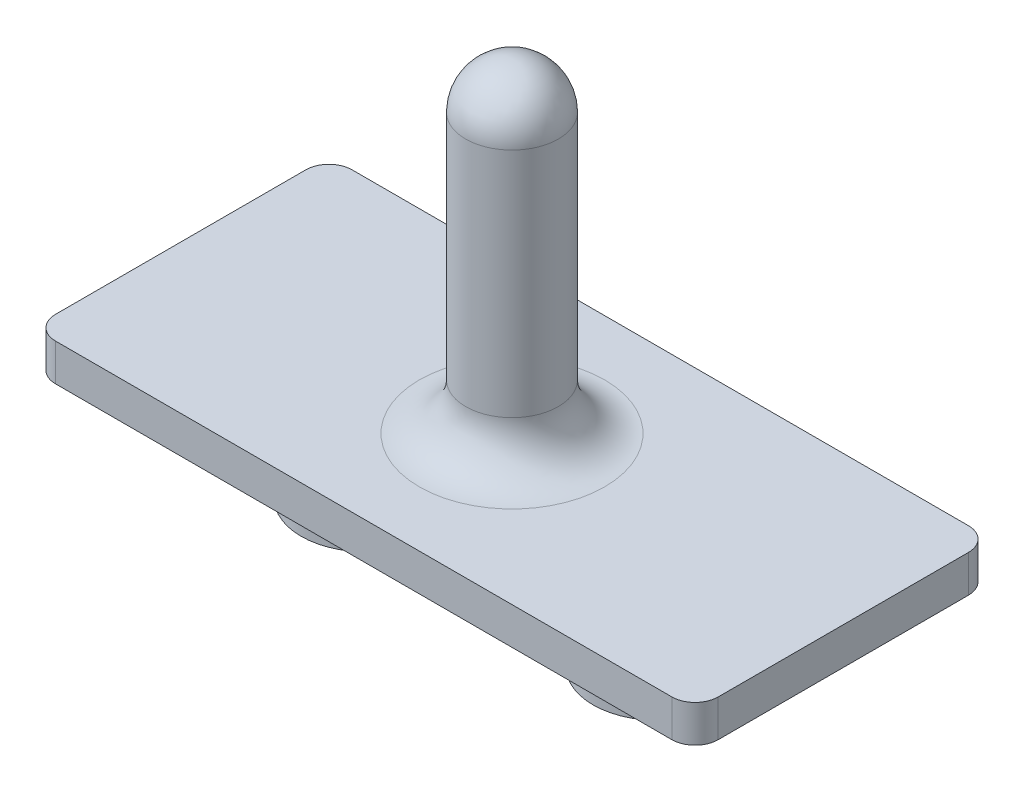
ISO-10303-21;
HEADER;
FILE_DESCRIPTION(('STEP AP214'),'2;1');
FILE_NAME('part.step','',(''),(''),'','','');
FILE_SCHEMA(('AUTOMOTIVE_DESIGN { 1 0 10303 214 1 1 1 1 }'));
ENDSEC;
DATA;
#1=APPLICATION_CONTEXT('core data for automotive mechanical design processes');
#2=APPLICATION_PROTOCOL_DEFINITION('international standard','automotive_design',2000,#1);
#3=PRODUCT_CONTEXT('',#1,'mechanical');
#4=PRODUCT('Part','Part','',(#3));
#5=PRODUCT_RELATED_PRODUCT_CATEGORY('part','',(#4));
#6=PRODUCT_DEFINITION_FORMATION('','',#4);
#7=PRODUCT_DEFINITION_CONTEXT('part definition',#1,'design');
#8=PRODUCT_DEFINITION('design','',#6,#7);
#9=PRODUCT_DEFINITION_SHAPE('','',#8);
#10=(LENGTH_UNIT() NAMED_UNIT(*) SI_UNIT(.MILLI.,.METRE.));
#11=(NAMED_UNIT(*) PLANE_ANGLE_UNIT() SI_UNIT($,.RADIAN.));
#12=(NAMED_UNIT(*) SI_UNIT($,.STERADIAN.) SOLID_ANGLE_UNIT());
#13=UNCERTAINTY_MEASURE_WITH_UNIT(LENGTH_MEASURE(1.E-05),#10,'distance_accuracy_value','');
#14=(GEOMETRIC_REPRESENTATION_CONTEXT(3) GLOBAL_UNCERTAINTY_ASSIGNED_CONTEXT((#13)) GLOBAL_UNIT_ASSIGNED_CONTEXT((#10,
#11,#12)) REPRESENTATION_CONTEXT('',''));
#15=CARTESIAN_POINT('',(0.,0.,0.));
#16=DIRECTION('',(0.,0.,1.));
#17=DIRECTION('',(1.,0.,0.));
#18=AXIS2_PLACEMENT_3D('',#15,#16,#17);
#19=CARTESIAN_POINT('',(0.,2.032,0.));
#20=DIRECTION('',(1.,0.,0.));
#21=DIRECTION('',(0.,0.,-1.));
#22=AXIS2_PLACEMENT_3D('',#19,#20,#21);
#23=PLANE('',#22);
#24=DIRECTION('',(0.,0.,1.));
#25=VECTOR('',#24,1.);
#26=CARTESIAN_POINT('',(0.,2.032,0.));
#27=LINE('',#26,#25);
#28=CARTESIAN_POINT('',(0.,2.032,1.27));
#29=VERTEX_POINT('',#28);
#30=CARTESIAN_POINT('',(0.,2.032,14.986));
#31=VERTEX_POINT('',#30);
#32=EDGE_CURVE('E137',#29,#31,#27,.T.);
#33=ORIENTED_EDGE('',*,*,#32,.F.);
#34=DIRECTION('',(0.,-1.,0.));
#35=VECTOR('',#34,1.);
#36=CARTESIAN_POINT('',(0.,2.032,1.27));
#37=LINE('',#36,#35);
#38=CARTESIAN_POINT('',(0.,0.,1.27));
#39=VERTEX_POINT('',#38);
#40=EDGE_CURVE('E193',#29,#39,#37,.T.);
#41=ORIENTED_EDGE('',*,*,#40,.T.);
#42=DIRECTION('',(0.,0.,1.));
#43=VECTOR('',#42,1.);
#44=CARTESIAN_POINT('',(0.,0.,0.));
#45=LINE('',#44,#43);
#46=CARTESIAN_POINT('',(0.,0.,14.986));
#47=VERTEX_POINT('',#46);
#48=EDGE_CURVE('E254',#39,#47,#45,.T.);
#49=ORIENTED_EDGE('',*,*,#48,.T.);
#50=DIRECTION('',(0.,-1.,0.));
#51=VECTOR('',#50,1.);
#52=CARTESIAN_POINT('',(0.,2.032,14.986));
#53=LINE('',#52,#51);
#54=EDGE_CURVE('E190',#47,#31,#53,.F.);
#55=ORIENTED_EDGE('',*,*,#54,.T.);
#56=EDGE_LOOP('',(#33,#41,#49,#55));
#57=FACE_BOUND('',#56,.T.);
#58=ADVANCED_FACE('F39',(#57),#23,.F.);
#59=CARTESIAN_POINT('',(0.,2.032,16.256));
#60=DIRECTION('',(0.,0.,-1.));
#61=DIRECTION('',(-1.,0.,0.));
#62=AXIS2_PLACEMENT_3D('',#59,#60,#61);
#63=PLANE('',#62);
#64=DIRECTION('',(1.,0.,0.));
#65=VECTOR('',#64,1.);
#66=CARTESIAN_POINT('',(0.,0.,16.256));
#67=LINE('',#66,#65);
#68=CARTESIAN_POINT('',(1.27,0.,16.256));
#69=VERTEX_POINT('',#68);
#70=CARTESIAN_POINT('',(35.052,0.,16.256));
#71=VERTEX_POINT('',#70);
#72=EDGE_CURVE('E144',#69,#71,#67,.T.);
#73=ORIENTED_EDGE('',*,*,#72,.T.);
#74=DIRECTION('',(0.,-1.,0.));
#75=VECTOR('',#74,1.);
#76=CARTESIAN_POINT('',(35.052,2.032,16.256));
#77=LINE('',#76,#75);
#78=CARTESIAN_POINT('',(35.052,2.032,16.256));
#79=VERTEX_POINT('',#78);
#80=EDGE_CURVE('E55',#71,#79,#77,.F.);
#81=ORIENTED_EDGE('',*,*,#80,.T.);
#82=DIRECTION('',(1.,0.,0.));
#83=VECTOR('',#82,1.);
#84=CARTESIAN_POINT('',(0.,2.032,16.256));
#85=LINE('',#84,#83);
#86=CARTESIAN_POINT('',(1.27,2.032,16.256));
#87=VERTEX_POINT('',#86);
#88=EDGE_CURVE('E142',#87,#79,#85,.T.);
#89=ORIENTED_EDGE('',*,*,#88,.F.);
#90=DIRECTION('',(0.,-1.,0.));
#91=VECTOR('',#90,1.);
#92=CARTESIAN_POINT('',(1.27,2.032,16.256));
#93=LINE('',#92,#91);
#94=EDGE_CURVE('E184',#87,#69,#93,.T.);
#95=ORIENTED_EDGE('',*,*,#94,.T.);
#96=EDGE_LOOP('',(#73,#81,#89,#95));
#97=FACE_BOUND('',#96,.T.);
#98=ADVANCED_FACE('F219',(#97),#63,.F.);
#99=CARTESIAN_POINT('',(36.322,2.032,0.));
#100=DIRECTION('',(-1.,0.,0.));
#101=DIRECTION('',(0.,0.,1.));
#102=AXIS2_PLACEMENT_3D('',#99,#100,#101);
#103=PLANE('',#102);
#104=DIRECTION('',(0.,0.,-1.));
#105=VECTOR('',#104,1.);
#106=CARTESIAN_POINT('',(36.322,0.,0.));
#107=LINE('',#106,#105);
#108=CARTESIAN_POINT('',(36.322,0.,14.986));
#109=VERTEX_POINT('',#108);
#110=CARTESIAN_POINT('',(36.322,0.,1.27));
#111=VERTEX_POINT('',#110);
#112=EDGE_CURVE('E138',#109,#111,#107,.T.);
#113=ORIENTED_EDGE('',*,*,#112,.T.);
#114=DIRECTION('',(0.,-1.,0.));
#115=VECTOR('',#114,1.);
#116=CARTESIAN_POINT('',(36.322,2.032,1.27));
#117=LINE('',#116,#115);
#118=CARTESIAN_POINT('',(36.322,2.032,1.27));
#119=VERTEX_POINT('',#118);
#120=EDGE_CURVE('E112',#111,#119,#117,.F.);
#121=ORIENTED_EDGE('',*,*,#120,.T.);
#122=DIRECTION('',(0.,0.,-1.));
#123=VECTOR('',#122,1.);
#124=CARTESIAN_POINT('',(36.322,2.032,0.));
#125=LINE('',#124,#123);
#126=CARTESIAN_POINT('',(36.322,2.032,14.986));
#127=VERTEX_POINT('',#126);
#128=EDGE_CURVE('E264',#127,#119,#125,.T.);
#129=ORIENTED_EDGE('',*,*,#128,.F.);
#130=DIRECTION('',(0.,-1.,0.));
#131=VECTOR('',#130,1.);
#132=CARTESIAN_POINT('',(36.322,2.032,14.986));
#133=LINE('',#132,#131);
#134=EDGE_CURVE('E118',#127,#109,#133,.T.);
#135=ORIENTED_EDGE('',*,*,#134,.T.);
#136=EDGE_LOOP('',(#113,#121,#129,#135));
#137=FACE_BOUND('',#136,.T.);
#138=ADVANCED_FACE('F225',(#137),#103,.F.);
#139=CARTESIAN_POINT('',(0.,2.032,0.));
#140=DIRECTION('',(0.,0.,1.));
#141=DIRECTION('',(1.,0.,0.));
#142=AXIS2_PLACEMENT_3D('',#139,#140,#141);
#143=PLANE('',#142);
#144=DIRECTION('',(-1.,0.,0.));
#145=VECTOR('',#144,1.);
#146=CARTESIAN_POINT('',(0.,2.032,0.));
#147=LINE('',#146,#145);
#148=CARTESIAN_POINT('',(35.052,2.032,0.));
#149=VERTEX_POINT('',#148);
#150=CARTESIAN_POINT('',(1.27,2.032,0.));
#151=VERTEX_POINT('',#150);
#152=EDGE_CURVE('E128',#149,#151,#147,.T.);
#153=ORIENTED_EDGE('',*,*,#152,.F.);
#154=DIRECTION('',(0.,-1.,0.));
#155=VECTOR('',#154,1.);
#156=CARTESIAN_POINT('',(35.052,2.032,0.));
#157=LINE('',#156,#155);
#158=CARTESIAN_POINT('',(35.052,0.,0.));
#159=VERTEX_POINT('',#158);
#160=EDGE_CURVE('E111',#149,#159,#157,.T.);
#161=ORIENTED_EDGE('',*,*,#160,.T.);
#162=DIRECTION('',(-1.,0.,0.));
#163=VECTOR('',#162,1.);
#164=CARTESIAN_POINT('',(0.,0.,0.));
#165=LINE('',#164,#163);
#166=CARTESIAN_POINT('',(1.27,0.,0.));
#167=VERTEX_POINT('',#166);
#168=EDGE_CURVE('E125',#159,#167,#165,.T.);
#169=ORIENTED_EDGE('',*,*,#168,.T.);
#170=DIRECTION('',(0.,-1.,0.));
#171=VECTOR('',#170,1.);
#172=CARTESIAN_POINT('',(1.27,2.032,0.));
#173=LINE('',#172,#171);
#174=EDGE_CURVE('E131',#167,#151,#173,.F.);
#175=ORIENTED_EDGE('',*,*,#174,.T.);
#176=EDGE_LOOP('',(#153,#161,#169,#175));
#177=FACE_BOUND('',#176,.T.);
#178=ADVANCED_FACE('F124',(#177),#143,.F.);
#179=CARTESIAN_POINT('',(0.,2.032,0.));
#180=DIRECTION('',(0.,1.,0.));
#181=DIRECTION('',(0.,0.,1.));
#182=AXIS2_PLACEMENT_3D('',#179,#180,#181);
#183=PLANE('',#182);
#184=CARTESIAN_POINT('',(18.161,2.032,8.128));
#185=DIRECTION('',(0.,1.,0.));
#186=DIRECTION('',(0.,0.,1.));
#187=AXIS2_PLACEMENT_3D('',#184,#185,#186);
#188=CIRCLE('',#187,5.08);
#189=CARTESIAN_POINT('',(18.161,2.032,13.208));
#190=VERTEX_POINT('',#189);
#191=EDGE_CURVE('E156',#190,#190,#188,.F.);
#192=ORIENTED_EDGE('',*,*,#191,.T.);
#193=EDGE_LOOP('',(#192));
#194=FACE_BOUND('',#193,.T.);
#195=ORIENTED_EDGE('',*,*,#128,.T.);
#196=CARTESIAN_POINT('',(35.052,2.032,1.27));
#197=DIRECTION('',(0.,1.,0.));
#198=DIRECTION('',(0.,0.,1.));
#199=AXIS2_PLACEMENT_3D('',#196,#197,#198);
#200=CIRCLE('',#199,1.27);
#201=EDGE_CURVE('E181',#119,#149,#200,.T.);
#202=ORIENTED_EDGE('',*,*,#201,.T.);
#203=ORIENTED_EDGE('',*,*,#152,.T.);
#204=CARTESIAN_POINT('',(1.27,2.032,1.27));
#205=DIRECTION('',(0.,1.,0.));
#206=DIRECTION('',(0.,0.,1.));
#207=AXIS2_PLACEMENT_3D('',#204,#205,#206);
#208=CIRCLE('',#207,1.27);
#209=EDGE_CURVE('E175',#151,#29,#208,.T.);
#210=ORIENTED_EDGE('',*,*,#209,.T.);
#211=ORIENTED_EDGE('',*,*,#32,.T.);
#212=CARTESIAN_POINT('',(1.27,2.032,14.986));
#213=DIRECTION('',(0.,1.,0.));
#214=DIRECTION('',(0.,0.,1.));
#215=AXIS2_PLACEMENT_3D('',#212,#213,#214);
#216=CIRCLE('',#215,1.27);
#217=EDGE_CURVE('E62',#31,#87,#216,.T.);
#218=ORIENTED_EDGE('',*,*,#217,.T.);
#219=ORIENTED_EDGE('',*,*,#88,.T.);
#220=CARTESIAN_POINT('',(35.052,2.032,14.986));
#221=DIRECTION('',(0.,1.,0.));
#222=DIRECTION('',(0.,0.,1.));
#223=AXIS2_PLACEMENT_3D('',#220,#221,#222);
#224=CIRCLE('',#223,1.27);
#225=EDGE_CURVE('E178',#79,#127,#224,.T.);
#226=ORIENTED_EDGE('',*,*,#225,.T.);
#227=EDGE_LOOP('',(#195,#202,#203,#210,#211,#218,#219,#226));
#228=FACE_BOUND('',#227,.T.);
#229=ADVANCED_FACE('F204',(#194,#228),#183,.T.);
#230=CARTESIAN_POINT('',(0.,0.,0.));
#231=DIRECTION('',(0.,1.,0.));
#232=DIRECTION('',(0.,0.,1.));
#233=AXIS2_PLACEMENT_3D('',#230,#231,#232);
#234=PLANE('',#233);
#235=CARTESIAN_POINT('',(26.162,0.,8.128));
#236=DIRECTION('',(0.,1.,0.));
#237=DIRECTION('',(0.,0.,1.));
#238=AXIS2_PLACEMENT_3D('',#235,#236,#237);
#239=CIRCLE('',#238,3.556);
#240=CARTESIAN_POINT('',(26.162,0.,11.684));
#241=VERTEX_POINT('',#240);
#242=EDGE_CURVE('E11',#241,#241,#239,.F.);
#243=ORIENTED_EDGE('',*,*,#242,.F.);
#244=EDGE_LOOP('',(#243));
#245=FACE_BOUND('',#244,.T.);
#246=CARTESIAN_POINT('',(10.16,0.,8.128));
#247=DIRECTION('',(0.,1.,0.));
#248=DIRECTION('',(0.,0.,1.));
#249=AXIS2_PLACEMENT_3D('',#246,#247,#248);
#250=CIRCLE('',#249,3.556);
#251=CARTESIAN_POINT('',(10.16,0.,11.684));
#252=VERTEX_POINT('',#251);
#253=EDGE_CURVE('E48',#252,#252,#250,.F.);
#254=ORIENTED_EDGE('',*,*,#253,.F.);
#255=EDGE_LOOP('',(#254));
#256=FACE_BOUND('',#255,.T.);
#257=ORIENTED_EDGE('',*,*,#168,.F.);
#258=CARTESIAN_POINT('',(35.052,0.,1.27));
#259=DIRECTION('',(0.,1.,0.));
#260=DIRECTION('',(0.,0.,1.));
#261=AXIS2_PLACEMENT_3D('',#258,#259,#260);
#262=CIRCLE('',#261,1.27);
#263=EDGE_CURVE('E107',#159,#111,#262,.F.);
#264=ORIENTED_EDGE('',*,*,#263,.T.);
#265=ORIENTED_EDGE('',*,*,#112,.F.);
#266=CARTESIAN_POINT('',(35.052,0.,14.986));
#267=DIRECTION('',(0.,1.,0.));
#268=DIRECTION('',(0.,0.,1.));
#269=AXIS2_PLACEMENT_3D('',#266,#267,#268);
#270=CIRCLE('',#269,1.27);
#271=EDGE_CURVE('E119',#109,#71,#270,.F.);
#272=ORIENTED_EDGE('',*,*,#271,.T.);
#273=ORIENTED_EDGE('',*,*,#72,.F.);
#274=CARTESIAN_POINT('',(1.27,0.,14.986));
#275=DIRECTION('',(0.,1.,0.));
#276=DIRECTION('',(0.,0.,1.));
#277=AXIS2_PLACEMENT_3D('',#274,#275,#276);
#278=CIRCLE('',#277,1.27);
#279=EDGE_CURVE('E130',#69,#47,#278,.F.);
#280=ORIENTED_EDGE('',*,*,#279,.T.);
#281=ORIENTED_EDGE('',*,*,#48,.F.);
#282=CARTESIAN_POINT('',(1.27,0.,1.27));
#283=DIRECTION('',(0.,1.,0.));
#284=DIRECTION('',(0.,0.,1.));
#285=AXIS2_PLACEMENT_3D('',#282,#283,#284);
#286=CIRCLE('',#285,1.27);
#287=EDGE_CURVE('E135',#39,#167,#286,.F.);
#288=ORIENTED_EDGE('',*,*,#287,.T.);
#289=EDGE_LOOP('',(#257,#264,#265,#272,#273,#280,#281,#288));
#290=FACE_BOUND('',#289,.T.);
#291=ADVANCED_FACE('F133',(#245,#256,#290),#234,.F.);
#292=CARTESIAN_POINT('',(18.161,19.812,8.128));
#293=DIRECTION('',(0.,-1.,0.));
#294=DIRECTION('',(0.,0.,-1.));
#295=AXIS2_PLACEMENT_3D('',#292,#293,#294);
#296=CYLINDRICAL_SURFACE('',#295,2.54);
#297=CARTESIAN_POINT('',(18.161,4.572,8.128));
#298=DIRECTION('',(0.,1.,0.));
#299=DIRECTION('',(0.,0.,1.));
#300=AXIS2_PLACEMENT_3D('',#297,#298,#299);
#301=CIRCLE('',#300,2.54);
#302=CARTESIAN_POINT('',(18.161,4.572,10.668));
#303=VERTEX_POINT('',#302);
#304=EDGE_CURVE('E152',#303,#303,#301,.T.);
#305=ORIENTED_EDGE('',*,*,#304,.T.);
#306=EDGE_LOOP('',(#305));
#307=FACE_BOUND('',#306,.T.);
#308=CARTESIAN_POINT('',(18.161,17.272,8.128));
#309=DIRECTION('',(0.,-1.,0.));
#310=DIRECTION('',(0.,0.,-1.));
#311=AXIS2_PLACEMENT_3D('',#308,#309,#310);
#312=CIRCLE('',#311,2.54);
#313=CARTESIAN_POINT('',(18.161,17.272,5.588));
#314=VERTEX_POINT('',#313);
#315=EDGE_CURVE('E148',#314,#314,#312,.T.);
#316=ORIENTED_EDGE('',*,*,#315,.T.);
#317=EDGE_LOOP('',(#316));
#318=FACE_BOUND('',#317,.T.);
#319=ADVANCED_FACE('F203',(#307,#318),#296,.T.);
#320=CARTESIAN_POINT('',(18.161,17.272,8.128));
#321=DIRECTION('',(0.,1.,0.));
#322=DIRECTION('',(0.,0.,1.));
#323=AXIS2_PLACEMENT_3D('',#320,#321,#322);
#324=SPHERICAL_SURFACE('',#323,2.54);
#325=ORIENTED_EDGE('',*,*,#315,.F.);
#326=EDGE_LOOP('',(#325));
#327=FACE_BOUND('',#326,.T.);
#328=ADVANCED_FACE('F211',(#327),#324,.T.);
#329=CARTESIAN_POINT('',(18.161,4.572,8.128));
#330=DIRECTION('',(0.,1.,0.));
#331=DIRECTION('',(0.,0.,1.));
#332=AXIS2_PLACEMENT_3D('',#329,#330,#331);
#333=TOROIDAL_SURFACE('',#332,5.08,2.54);
#334=ORIENTED_EDGE('',*,*,#191,.F.);
#335=EDGE_LOOP('',(#334));
#336=FACE_BOUND('',#335,.T.);
#337=ORIENTED_EDGE('',*,*,#304,.F.);
#338=EDGE_LOOP('',(#337));
#339=FACE_BOUND('',#338,.T.);
#340=ADVANCED_FACE('F232',(#336,#339),#333,.F.);
#341=CARTESIAN_POINT('',(35.052,2.032,1.27));
#342=DIRECTION('',(0.,-1.,0.));
#343=DIRECTION('',(0.,0.,-1.));
#344=AXIS2_PLACEMENT_3D('',#341,#342,#343);
#345=CYLINDRICAL_SURFACE('',#344,1.27);
#346=ORIENTED_EDGE('',*,*,#201,.F.);
#347=ORIENTED_EDGE('',*,*,#120,.F.);
#348=ORIENTED_EDGE('',*,*,#263,.F.);
#349=ORIENTED_EDGE('',*,*,#160,.F.);
#350=EDGE_LOOP('',(#346,#347,#348,#349));
#351=FACE_BOUND('',#350,.T.);
#352=ADVANCED_FACE('F110',(#351),#345,.T.);
#353=CARTESIAN_POINT('',(35.052,2.032,14.986));
#354=DIRECTION('',(0.,-1.,0.));
#355=DIRECTION('',(0.,0.,-1.));
#356=AXIS2_PLACEMENT_3D('',#353,#354,#355);
#357=CYLINDRICAL_SURFACE('',#356,1.27);
#358=ORIENTED_EDGE('',*,*,#225,.F.);
#359=ORIENTED_EDGE('',*,*,#80,.F.);
#360=ORIENTED_EDGE('',*,*,#271,.F.);
#361=ORIENTED_EDGE('',*,*,#134,.F.);
#362=EDGE_LOOP('',(#358,#359,#360,#361));
#363=FACE_BOUND('',#362,.T.);
#364=ADVANCED_FACE('F239',(#363),#357,.T.);
#365=CARTESIAN_POINT('',(1.27,2.032,1.27));
#366=DIRECTION('',(0.,-1.,0.));
#367=DIRECTION('',(0.,0.,-1.));
#368=AXIS2_PLACEMENT_3D('',#365,#366,#367);
#369=CYLINDRICAL_SURFACE('',#368,1.27);
#370=ORIENTED_EDGE('',*,*,#209,.F.);
#371=ORIENTED_EDGE('',*,*,#174,.F.);
#372=ORIENTED_EDGE('',*,*,#287,.F.);
#373=ORIENTED_EDGE('',*,*,#40,.F.);
#374=EDGE_LOOP('',(#370,#371,#372,#373));
#375=FACE_BOUND('',#374,.T.);
#376=ADVANCED_FACE('F241',(#375),#369,.T.);
#377=CARTESIAN_POINT('',(1.27,2.032,14.986));
#378=DIRECTION('',(0.,-1.,0.));
#379=DIRECTION('',(0.,0.,-1.));
#380=AXIS2_PLACEMENT_3D('',#377,#378,#379);
#381=CYLINDRICAL_SURFACE('',#380,1.27);
#382=ORIENTED_EDGE('',*,*,#217,.F.);
#383=ORIENTED_EDGE('',*,*,#54,.F.);
#384=ORIENTED_EDGE('',*,*,#279,.F.);
#385=ORIENTED_EDGE('',*,*,#94,.F.);
#386=EDGE_LOOP('',(#382,#383,#384,#385));
#387=FACE_BOUND('',#386,.T.);
#388=ADVANCED_FACE('F41',(#387),#381,.T.);
#389=CARTESIAN_POINT('',(10.16,-5.08,8.128));
#390=DIRECTION('',(0.,1.,0.));
#391=DIRECTION('',(0.,0.,1.));
#392=AXIS2_PLACEMENT_3D('',#389,#390,#391);
#393=CYLINDRICAL_SURFACE('',#392,3.556);
#394=CARTESIAN_POINT('',(10.16,-5.08,8.128));
#395=DIRECTION('',(0.,-1.,0.));
#396=DIRECTION('',(0.,0.,-1.));
#397=AXIS2_PLACEMENT_3D('',#394,#395,#396);
#398=CIRCLE('',#397,3.556);
#399=CARTESIAN_POINT('',(10.16,-5.08,4.572));
#400=VERTEX_POINT('',#399);
#401=EDGE_CURVE('E259',#400,#400,#398,.T.);
#402=ORIENTED_EDGE('',*,*,#401,.F.);
#403=EDGE_LOOP('',(#402));
#404=FACE_BOUND('',#403,.T.);
#405=ORIENTED_EDGE('',*,*,#253,.T.);
#406=EDGE_LOOP('',(#405));
#407=FACE_BOUND('',#406,.T.);
#408=ADVANCED_FACE('F200',(#404,#407),#393,.T.);
#409=CARTESIAN_POINT('',(10.16,-5.08,8.128));
#410=DIRECTION('',(0.,-1.,0.));
#411=DIRECTION('',(0.,0.,-1.));
#412=AXIS2_PLACEMENT_3D('',#409,#410,#411);
#413=PLANE('',#412);
#414=ORIENTED_EDGE('',*,*,#401,.T.);
#415=EDGE_LOOP('',(#414));
#416=FACE_BOUND('',#415,.T.);
#417=ADVANCED_FACE('F282',(#416),#413,.T.);
#418=CARTESIAN_POINT('',(26.162,-5.08,8.128));
#419=DIRECTION('',(0.,1.,0.));
#420=DIRECTION('',(0.,0.,1.));
#421=AXIS2_PLACEMENT_3D('',#418,#419,#420);
#422=CYLINDRICAL_SURFACE('',#421,3.556);
#423=CARTESIAN_POINT('',(26.162,-5.08,8.128));
#424=DIRECTION('',(0.,-1.,0.));
#425=DIRECTION('',(0.,0.,-1.));
#426=AXIS2_PLACEMENT_3D('',#423,#424,#425);
#427=CIRCLE('',#426,3.556);
#428=CARTESIAN_POINT('',(26.162,-5.08,4.572));
#429=VERTEX_POINT('',#428);
#430=EDGE_CURVE('E272',#429,#429,#427,.T.);
#431=ORIENTED_EDGE('',*,*,#430,.F.);
#432=EDGE_LOOP('',(#431));
#433=FACE_BOUND('',#432,.T.);
#434=ORIENTED_EDGE('',*,*,#242,.T.);
#435=EDGE_LOOP('',(#434));
#436=FACE_BOUND('',#435,.T.);
#437=ADVANCED_FACE('F279',(#433,#436),#422,.T.);
#438=CARTESIAN_POINT('',(26.162,-5.08,8.128));
#439=DIRECTION('',(0.,-1.,0.));
#440=DIRECTION('',(0.,0.,-1.));
#441=AXIS2_PLACEMENT_3D('',#438,#439,#440);
#442=PLANE('',#441);
#443=ORIENTED_EDGE('',*,*,#430,.T.);
#444=EDGE_LOOP('',(#443));
#445=FACE_BOUND('',#444,.T.);
#446=ADVANCED_FACE('F277',(#445),#442,.T.);
#447=CLOSED_SHELL('',(#58,#98,#138,#178,#229,#291,#319,#328,#340,#352,#364,#376,#388,#408,#417,
#437,#446));
#448=MANIFOLD_SOLID_BREP('B2',#447);
#449=ADVANCED_BREP_SHAPE_REPRESENTATION('',(#18,#448),#14);
#450=SHAPE_DEFINITION_REPRESENTATION(#9,#449);
ENDSEC;
END-ISO-10303-21;
